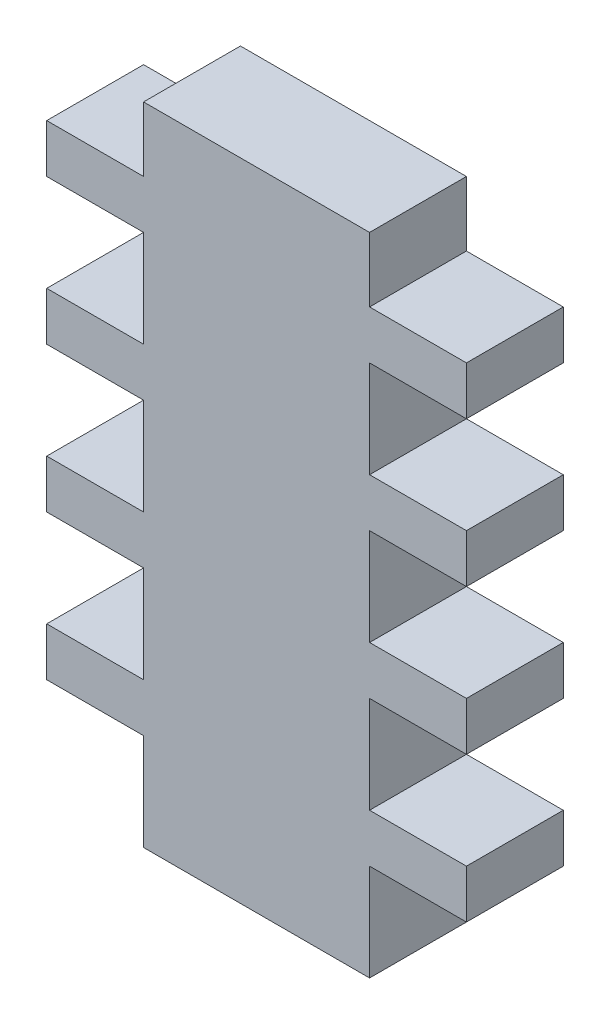
ISO-10303-21;
HEADER;
FILE_DESCRIPTION(('STEP AP214'),'2;1');
FILE_NAME('part.step','',(''),(''),'','','');
FILE_SCHEMA(('AUTOMOTIVE_DESIGN { 1 0 10303 214 1 1 1 1 }'));
ENDSEC;
DATA;
#1=APPLICATION_CONTEXT('core data for automotive mechanical design processes');
#2=APPLICATION_PROTOCOL_DEFINITION('international standard','automotive_design',2000,#1);
#3=PRODUCT_CONTEXT('',#1,'mechanical');
#4=PRODUCT('Part','Part','',(#3));
#5=PRODUCT_RELATED_PRODUCT_CATEGORY('part','',(#4));
#6=PRODUCT_DEFINITION_FORMATION('','',#4);
#7=PRODUCT_DEFINITION_CONTEXT('part definition',#1,'design');
#8=PRODUCT_DEFINITION('design','',#6,#7);
#9=PRODUCT_DEFINITION_SHAPE('','',#8);
#10=(LENGTH_UNIT() NAMED_UNIT(*) SI_UNIT(.MILLI.,.METRE.));
#11=(NAMED_UNIT(*) PLANE_ANGLE_UNIT() SI_UNIT($,.RADIAN.));
#12=(NAMED_UNIT(*) SI_UNIT($,.STERADIAN.) SOLID_ANGLE_UNIT());
#13=UNCERTAINTY_MEASURE_WITH_UNIT(LENGTH_MEASURE(1.E-05),#10,'distance_accuracy_value','');
#14=(GEOMETRIC_REPRESENTATION_CONTEXT(3) GLOBAL_UNCERTAINTY_ASSIGNED_CONTEXT((#13)) GLOBAL_UNIT_ASSIGNED_CONTEXT((#10,
#11,#12)) REPRESENTATION_CONTEXT('',''));
#15=CARTESIAN_POINT('',(0.,0.,0.));
#16=DIRECTION('',(0.,0.,1.));
#17=DIRECTION('',(1.,0.,0.));
#18=AXIS2_PLACEMENT_3D('',#15,#16,#17);
#19=CARTESIAN_POINT('',(6.5,-10.,3.));
#20=DIRECTION('',(-1.,0.,0.));
#21=DIRECTION('',(0.,0.,1.));
#22=AXIS2_PLACEMENT_3D('',#19,#20,#21);
#23=PLANE('',#22);
#24=DIRECTION('',(0.,1.,0.));
#25=VECTOR('',#24,1.);
#26=CARTESIAN_POINT('',(6.5,-10.,0.));
#27=LINE('',#26,#25);
#28=CARTESIAN_POINT('',(6.5,2.,0.));
#29=VERTEX_POINT('',#28);
#30=CARTESIAN_POINT('',(6.5,3.5,0.));
#31=VERTEX_POINT('',#30);
#32=EDGE_CURVE('E523',#29,#31,#27,.T.);
#33=ORIENTED_EDGE('',*,*,#32,.T.);
#34=DIRECTION('',(0.,0.,1.));
#35=VECTOR('',#34,1.);
#36=CARTESIAN_POINT('',(6.5,3.5,0.));
#37=LINE('',#36,#35);
#38=CARTESIAN_POINT('',(6.5,3.5,3.));
#39=VERTEX_POINT('',#38);
#40=EDGE_CURVE('E313',#31,#39,#37,.T.);
#41=ORIENTED_EDGE('',*,*,#40,.T.);
#42=DIRECTION('',(0.,1.,0.));
#43=VECTOR('',#42,1.);
#44=CARTESIAN_POINT('',(6.5,-10.,3.));
#45=LINE('',#44,#43);
#46=CARTESIAN_POINT('',(6.5,2.,3.));
#47=VERTEX_POINT('',#46);
#48=EDGE_CURVE('E514',#47,#39,#45,.T.);
#49=ORIENTED_EDGE('',*,*,#48,.F.);
#50=DIRECTION('',(0.,0.,1.));
#51=VECTOR('',#50,1.);
#52=CARTESIAN_POINT('',(6.5,2.,0.));
#53=LINE('',#52,#51);
#54=EDGE_CURVE('E330',#29,#47,#53,.T.);
#55=ORIENTED_EDGE('',*,*,#54,.F.);
#56=EDGE_LOOP('',(#33,#41,#49,#55));
#57=FACE_BOUND('',#56,.T.);
#58=ADVANCED_FACE('F38',(#57),#23,.F.);
#59=CARTESIAN_POINT('',(6.5,-2.5,0.));
#60=VERTEX_POINT('',#59);
#61=CARTESIAN_POINT('',(6.5,-0.999999999999998,0.));
#62=VERTEX_POINT('',#61);
#63=EDGE_CURVE('E604',#60,#62,#27,.T.);
#64=ORIENTED_EDGE('',*,*,#63,.T.);
#65=DIRECTION('',(0.,0.,1.));
#66=VECTOR('',#65,1.);
#67=CARTESIAN_POINT('',(6.5,-0.999999999999998,0.));
#68=LINE('',#67,#66);
#69=CARTESIAN_POINT('',(6.5,-0.999999999999998,3.));
#70=VERTEX_POINT('',#69);
#71=EDGE_CURVE('E337',#62,#70,#68,.T.);
#72=ORIENTED_EDGE('',*,*,#71,.T.);
#73=CARTESIAN_POINT('',(6.5,-2.5,3.));
#74=VERTEX_POINT('',#73);
#75=EDGE_CURVE('E623',#74,#70,#45,.T.);
#76=ORIENTED_EDGE('',*,*,#75,.F.);
#77=DIRECTION('',(0.,0.,1.));
#78=VECTOR('',#77,1.);
#79=CARTESIAN_POINT('',(6.5,-2.5,0.));
#80=LINE('',#79,#78);
#81=EDGE_CURVE('E354',#60,#74,#80,.T.);
#82=ORIENTED_EDGE('',*,*,#81,.F.);
#83=EDGE_LOOP('',(#64,#72,#76,#82));
#84=FACE_BOUND('',#83,.T.);
#85=ADVANCED_FACE('F637',(#84),#23,.F.);
#86=CARTESIAN_POINT('',(6.5,-7.,0.));
#87=VERTEX_POINT('',#86);
#88=CARTESIAN_POINT('',(6.5,-5.5,0.));
#89=VERTEX_POINT('',#88);
#90=EDGE_CURVE('E524',#87,#89,#27,.T.);
#91=ORIENTED_EDGE('',*,*,#90,.T.);
#92=DIRECTION('',(0.,0.,1.));
#93=VECTOR('',#92,1.);
#94=CARTESIAN_POINT('',(6.5,-5.5,0.));
#95=LINE('',#94,#93);
#96=CARTESIAN_POINT('',(6.5,-5.5,3.));
#97=VERTEX_POINT('',#96);
#98=EDGE_CURVE('E361',#89,#97,#95,.T.);
#99=ORIENTED_EDGE('',*,*,#98,.T.);
#100=CARTESIAN_POINT('',(6.5,-7.,3.));
#101=VERTEX_POINT('',#100);
#102=EDGE_CURVE('E515',#101,#97,#45,.T.);
#103=ORIENTED_EDGE('',*,*,#102,.F.);
#104=DIRECTION('',(0.,0.,1.));
#105=VECTOR('',#104,1.);
#106=CARTESIAN_POINT('',(6.5,-7.,0.));
#107=LINE('',#106,#105);
#108=EDGE_CURVE('E380',#87,#101,#107,.T.);
#109=ORIENTED_EDGE('',*,*,#108,.F.);
#110=EDGE_LOOP('',(#91,#99,#103,#109));
#111=FACE_BOUND('',#110,.T.);
#112=ADVANCED_FACE('F602',(#111),#23,.F.);
#113=CARTESIAN_POINT('',(-6.5,-10.,3.));
#114=DIRECTION('',(1.,0.,0.));
#115=DIRECTION('',(0.,0.,-1.));
#116=AXIS2_PLACEMENT_3D('',#113,#114,#115);
#117=PLANE('',#116);
#118=DIRECTION('',(0.,-1.,0.));
#119=VECTOR('',#118,1.);
#120=CARTESIAN_POINT('',(-6.5,-10.,3.));
#121=LINE('',#120,#119);
#122=CARTESIAN_POINT('',(-6.5,8.,3.));
#123=VERTEX_POINT('',#122);
#124=CARTESIAN_POINT('',(-6.5,6.5,3.));
#125=VERTEX_POINT('',#124);
#126=EDGE_CURVE('E47',#123,#125,#121,.T.);
#127=ORIENTED_EDGE('',*,*,#126,.F.);
#128=DIRECTION('',(0.,0.,1.));
#129=VECTOR('',#128,1.);
#130=CARTESIAN_POINT('',(-6.5,8.,0.));
#131=LINE('',#130,#129);
#132=CARTESIAN_POINT('',(-6.5,8.,0.));
#133=VERTEX_POINT('',#132);
#134=EDGE_CURVE('E403',#133,#123,#131,.T.);
#135=ORIENTED_EDGE('',*,*,#134,.F.);
#136=DIRECTION('',(0.,-1.,0.));
#137=VECTOR('',#136,1.);
#138=CARTESIAN_POINT('',(-6.5,-10.,0.));
#139=LINE('',#138,#137);
#140=CARTESIAN_POINT('',(-6.5,6.5,0.));
#141=VERTEX_POINT('',#140);
#142=EDGE_CURVE('E528',#133,#141,#139,.T.);
#143=ORIENTED_EDGE('',*,*,#142,.T.);
#144=DIRECTION('',(0.,0.,1.));
#145=VECTOR('',#144,1.);
#146=CARTESIAN_POINT('',(-6.5,6.5,0.));
#147=LINE('',#146,#145);
#148=EDGE_CURVE('E424',#141,#125,#147,.T.);
#149=ORIENTED_EDGE('',*,*,#148,.T.);
#150=EDGE_LOOP('',(#127,#135,#143,#149));
#151=FACE_BOUND('',#150,.T.);
#152=ADVANCED_FACE('F668',(#151),#117,.F.);
#153=CARTESIAN_POINT('',(-6.5,3.5,3.));
#154=VERTEX_POINT('',#153);
#155=CARTESIAN_POINT('',(-6.5,2.,3.));
#156=VERTEX_POINT('',#155);
#157=EDGE_CURVE('E555',#154,#156,#121,.T.);
#158=ORIENTED_EDGE('',*,*,#157,.F.);
#159=DIRECTION('',(0.,0.,1.));
#160=VECTOR('',#159,1.);
#161=CARTESIAN_POINT('',(-6.5,3.5,0.));
#162=LINE('',#161,#160);
#163=CARTESIAN_POINT('',(-6.5,3.5,0.));
#164=VERTEX_POINT('',#163);
#165=EDGE_CURVE('E417',#164,#154,#162,.T.);
#166=ORIENTED_EDGE('',*,*,#165,.F.);
#167=CARTESIAN_POINT('',(-6.5,2.,0.));
#168=VERTEX_POINT('',#167);
#169=EDGE_CURVE('E533',#164,#168,#139,.T.);
#170=ORIENTED_EDGE('',*,*,#169,.T.);
#171=DIRECTION('',(0.,0.,1.));
#172=VECTOR('',#171,1.);
#173=CARTESIAN_POINT('',(-6.5,2.,0.));
#174=LINE('',#173,#172);
#175=EDGE_CURVE('E450',#168,#156,#174,.T.);
#176=ORIENTED_EDGE('',*,*,#175,.T.);
#177=EDGE_LOOP('',(#158,#166,#170,#176));
#178=FACE_BOUND('',#177,.T.);
#179=ADVANCED_FACE('F544',(#178),#117,.F.);
#180=CARTESIAN_POINT('',(-6.5,-0.999999999999997,3.));
#181=VERTEX_POINT('',#180);
#182=CARTESIAN_POINT('',(-6.5,-2.5,3.));
#183=VERTEX_POINT('',#182);
#184=EDGE_CURVE('E520',#181,#183,#121,.T.);
#185=ORIENTED_EDGE('',*,*,#184,.F.);
#186=DIRECTION('',(0.,0.,1.));
#187=VECTOR('',#186,1.);
#188=CARTESIAN_POINT('',(-6.5,-0.999999999999997,0.));
#189=LINE('',#188,#187);
#190=CARTESIAN_POINT('',(-6.5,-0.999999999999997,0.));
#191=VERTEX_POINT('',#190);
#192=EDGE_CURVE('E443',#191,#181,#189,.T.);
#193=ORIENTED_EDGE('',*,*,#192,.F.);
#194=CARTESIAN_POINT('',(-6.5,-2.5,0.));
#195=VERTEX_POINT('',#194);
#196=EDGE_CURVE('E527',#191,#195,#139,.T.);
#197=ORIENTED_EDGE('',*,*,#196,.T.);
#198=DIRECTION('',(0.,0.,1.));
#199=VECTOR('',#198,1.);
#200=CARTESIAN_POINT('',(-6.5,-2.5,0.));
#201=LINE('',#200,#199);
#202=EDGE_CURVE('E476',#195,#183,#201,.T.);
#203=ORIENTED_EDGE('',*,*,#202,.T.);
#204=EDGE_LOOP('',(#185,#193,#197,#203));
#205=FACE_BOUND('',#204,.T.);
#206=ADVANCED_FACE('F564',(#205),#117,.F.);
#207=CARTESIAN_POINT('',(6.5,6.5,0.));
#208=VERTEX_POINT('',#207);
#209=CARTESIAN_POINT('',(6.5,8.,0.));
#210=VERTEX_POINT('',#209);
#211=EDGE_CURVE('E413',#208,#210,#27,.T.);
#212=ORIENTED_EDGE('',*,*,#211,.T.);
#213=DIRECTION('',(0.,0.,1.));
#214=VECTOR('',#213,1.);
#215=CARTESIAN_POINT('',(6.5,8.,0.));
#216=LINE('',#215,#214);
#217=CARTESIAN_POINT('',(6.5,8.,3.));
#218=VERTEX_POINT('',#217);
#219=EDGE_CURVE('E282',#210,#218,#216,.T.);
#220=ORIENTED_EDGE('',*,*,#219,.T.);
#221=CARTESIAN_POINT('',(6.5,6.5,3.));
#222=VERTEX_POINT('',#221);
#223=EDGE_CURVE('E511',#222,#218,#45,.T.);
#224=ORIENTED_EDGE('',*,*,#223,.F.);
#225=DIRECTION('',(0.,0.,1.));
#226=VECTOR('',#225,1.);
#227=CARTESIAN_POINT('',(6.5,6.5,0.));
#228=LINE('',#227,#226);
#229=EDGE_CURVE('E306',#208,#222,#228,.T.);
#230=ORIENTED_EDGE('',*,*,#229,.F.);
#231=EDGE_LOOP('',(#212,#220,#224,#230));
#232=FACE_BOUND('',#231,.T.);
#233=ADVANCED_FACE('F40',(#232),#23,.F.);
#234=CARTESIAN_POINT('',(-6.5,10.,3.));
#235=DIRECTION('',(0.,-1.,0.));
#236=DIRECTION('',(0.,0.,-1.));
#237=AXIS2_PLACEMENT_3D('',#234,#235,#236);
#238=PLANE('',#237);
#239=DIRECTION('',(-1.,0.,0.));
#240=VECTOR('',#239,1.);
#241=CARTESIAN_POINT('',(-6.5,10.,3.));
#242=LINE('',#241,#240);
#243=CARTESIAN_POINT('',(3.5,10.,3.));
#244=VERTEX_POINT('',#243);
#245=CARTESIAN_POINT('',(-3.5,10.,3.));
#246=VERTEX_POINT('',#245);
#247=EDGE_CURVE('E516',#244,#246,#242,.T.);
#248=ORIENTED_EDGE('',*,*,#247,.F.);
#249=DIRECTION('',(0.,0.,1.));
#250=VECTOR('',#249,1.);
#251=CARTESIAN_POINT('',(3.5,10.,0.));
#252=LINE('',#251,#250);
#253=CARTESIAN_POINT('',(3.5,10.,0.));
#254=VERTEX_POINT('',#253);
#255=EDGE_CURVE('E302',#254,#244,#252,.T.);
#256=ORIENTED_EDGE('',*,*,#255,.F.);
#257=DIRECTION('',(-1.,0.,0.));
#258=VECTOR('',#257,1.);
#259=CARTESIAN_POINT('',(-6.5,10.,0.));
#260=LINE('',#259,#258);
#261=CARTESIAN_POINT('',(-3.5,10.,0.));
#262=VERTEX_POINT('',#261);
#263=EDGE_CURVE('E295',#254,#262,#260,.T.);
#264=ORIENTED_EDGE('',*,*,#263,.T.);
#265=DIRECTION('',(0.,0.,1.));
#266=VECTOR('',#265,1.);
#267=CARTESIAN_POINT('',(-3.5,10.,0.));
#268=LINE('',#267,#266);
#269=EDGE_CURVE('E410',#262,#246,#268,.T.);
#270=ORIENTED_EDGE('',*,*,#269,.T.);
#271=EDGE_LOOP('',(#248,#256,#264,#270));
#272=FACE_BOUND('',#271,.T.);
#273=ADVANCED_FACE('F659',(#272),#238,.F.);
#274=CARTESIAN_POINT('',(-6.5,-5.5,3.));
#275=VERTEX_POINT('',#274);
#276=CARTESIAN_POINT('',(-6.5,-7.,3.));
#277=VERTEX_POINT('',#276);
#278=EDGE_CURVE('E518',#275,#277,#121,.T.);
#279=ORIENTED_EDGE('',*,*,#278,.F.);
#280=DIRECTION('',(0.,0.,1.));
#281=VECTOR('',#280,1.);
#282=CARTESIAN_POINT('',(-6.5,-5.5,0.));
#283=LINE('',#282,#281);
#284=CARTESIAN_POINT('',(-6.5,-5.5,0.));
#285=VERTEX_POINT('',#284);
#286=EDGE_CURVE('E469',#285,#275,#283,.T.);
#287=ORIENTED_EDGE('',*,*,#286,.F.);
#288=CARTESIAN_POINT('',(-6.5,-7.,0.));
#289=VERTEX_POINT('',#288);
#290=EDGE_CURVE('E525',#285,#289,#139,.T.);
#291=ORIENTED_EDGE('',*,*,#290,.T.);
#292=DIRECTION('',(0.,0.,1.));
#293=VECTOR('',#292,1.);
#294=CARTESIAN_POINT('',(-6.5,-7.,0.));
#295=LINE('',#294,#293);
#296=EDGE_CURVE('E304',#289,#277,#295,.T.);
#297=ORIENTED_EDGE('',*,*,#296,.T.);
#298=EDGE_LOOP('',(#279,#287,#291,#297));
#299=FACE_BOUND('',#298,.T.);
#300=ADVANCED_FACE('F577',(#299),#117,.F.);
#301=CARTESIAN_POINT('',(-6.5,-10.,3.));
#302=DIRECTION('',(0.,1.,0.));
#303=DIRECTION('',(0.,0.,1.));
#304=AXIS2_PLACEMENT_3D('',#301,#302,#303);
#305=PLANE('',#304);
#306=DIRECTION('',(1.,0.,0.));
#307=VECTOR('',#306,1.);
#308=CARTESIAN_POINT('',(-6.5,-10.,0.));
#309=LINE('',#308,#307);
#310=CARTESIAN_POINT('',(-3.5,-10.,0.));
#311=VERTEX_POINT('',#310);
#312=CARTESIAN_POINT('',(3.5,-10.,0.));
#313=VERTEX_POINT('',#312);
#314=EDGE_CURVE('E42',#311,#313,#309,.T.);
#315=ORIENTED_EDGE('',*,*,#314,.T.);
#316=DIRECTION('',(0.,0.,1.));
#317=VECTOR('',#316,1.);
#318=CARTESIAN_POINT('',(3.5,-10.,0.));
#319=LINE('',#318,#317);
#320=CARTESIAN_POINT('',(3.5,-10.,3.));
#321=VERTEX_POINT('',#320);
#322=EDGE_CURVE('E385',#313,#321,#319,.T.);
#323=ORIENTED_EDGE('',*,*,#322,.T.);
#324=DIRECTION('',(1.,0.,0.));
#325=VECTOR('',#324,1.);
#326=CARTESIAN_POINT('',(-6.5,-10.,3.));
#327=LINE('',#326,#325);
#328=CARTESIAN_POINT('',(-3.5,-10.,3.));
#329=VERTEX_POINT('',#328);
#330=EDGE_CURVE('E11',#329,#321,#327,.T.);
#331=ORIENTED_EDGE('',*,*,#330,.F.);
#332=DIRECTION('',(0.,0.,1.));
#333=VECTOR('',#332,1.);
#334=CARTESIAN_POINT('',(-3.5,-10.,0.));
#335=LINE('',#334,#333);
#336=EDGE_CURVE('E495',#311,#329,#335,.T.);
#337=ORIENTED_EDGE('',*,*,#336,.F.);
#338=EDGE_LOOP('',(#315,#323,#331,#337));
#339=FACE_BOUND('',#338,.T.);
#340=ADVANCED_FACE('F588',(#339),#305,.F.);
#341=CARTESIAN_POINT('',(0.,0.,3.));
#342=DIRECTION('',(0.,0.,-1.));
#343=DIRECTION('',(-1.,0.,0.));
#344=AXIS2_PLACEMENT_3D('',#341,#342,#343);
#345=PLANE('',#344);
#346=DIRECTION('',(1.,0.,0.));
#347=VECTOR('',#346,1.);
#348=CARTESIAN_POINT('',(3.5,8.,3.));
#349=LINE('',#348,#347);
#350=CARTESIAN_POINT('',(3.5,8.,3.));
#351=VERTEX_POINT('',#350);
#352=EDGE_CURVE('E296',#351,#218,#349,.T.);
#353=ORIENTED_EDGE('',*,*,#352,.F.);
#354=DIRECTION('',(0.,-1.,0.));
#355=VECTOR('',#354,1.);
#356=CARTESIAN_POINT('',(3.5,10.,3.));
#357=LINE('',#356,#355);
#358=EDGE_CURVE('E279',#244,#351,#357,.T.);
#359=ORIENTED_EDGE('',*,*,#358,.F.);
#360=ORIENTED_EDGE('',*,*,#247,.T.);
#361=DIRECTION('',(0.,1.,0.));
#362=VECTOR('',#361,1.);
#363=CARTESIAN_POINT('',(-3.5,8.,3.));
#364=LINE('',#363,#362);
#365=CARTESIAN_POINT('',(-3.5,8.,3.));
#366=VERTEX_POINT('',#365);
#367=EDGE_CURVE('E401',#366,#246,#364,.T.);
#368=ORIENTED_EDGE('',*,*,#367,.F.);
#369=DIRECTION('',(1.,0.,0.));
#370=VECTOR('',#369,1.);
#371=CARTESIAN_POINT('',(-6.5,8.,3.));
#372=LINE('',#371,#370);
#373=EDGE_CURVE('E404',#123,#366,#372,.T.);
#374=ORIENTED_EDGE('',*,*,#373,.F.);
#375=ORIENTED_EDGE('',*,*,#126,.T.);
#376=DIRECTION('',(-1.,0.,0.));
#377=VECTOR('',#376,1.);
#378=CARTESIAN_POINT('',(-6.5,6.5,3.));
#379=LINE('',#378,#377);
#380=CARTESIAN_POINT('',(-3.5,6.5,3.));
#381=VERTEX_POINT('',#380);
#382=EDGE_CURVE('E428',#381,#125,#379,.T.);
#383=ORIENTED_EDGE('',*,*,#382,.F.);
#384=DIRECTION('',(0.,1.,0.));
#385=VECTOR('',#384,1.);
#386=CARTESIAN_POINT('',(-3.5,6.5,3.));
#387=LINE('',#386,#385);
#388=CARTESIAN_POINT('',(-3.5,3.5,3.));
#389=VERTEX_POINT('',#388);
#390=EDGE_CURVE('E430',#389,#381,#387,.T.);
#391=ORIENTED_EDGE('',*,*,#390,.F.);
#392=DIRECTION('',(1.,0.,0.));
#393=VECTOR('',#392,1.);
#394=CARTESIAN_POINT('',(-6.5,3.5,3.));
#395=LINE('',#394,#393);
#396=EDGE_CURVE('E407',#154,#389,#395,.T.);
#397=ORIENTED_EDGE('',*,*,#396,.F.);
#398=ORIENTED_EDGE('',*,*,#157,.T.);
#399=DIRECTION('',(-1.,0.,0.));
#400=VECTOR('',#399,1.);
#401=CARTESIAN_POINT('',(-6.5,2.,3.));
#402=LINE('',#401,#400);
#403=CARTESIAN_POINT('',(-3.5,2.,3.));
#404=VERTEX_POINT('',#403);
#405=EDGE_CURVE('E454',#404,#156,#402,.T.);
#406=ORIENTED_EDGE('',*,*,#405,.F.);
#407=DIRECTION('',(0.,1.,0.));
#408=VECTOR('',#407,1.);
#409=CARTESIAN_POINT('',(-3.5,2.,3.));
#410=LINE('',#409,#408);
#411=CARTESIAN_POINT('',(-3.5,-0.999999999999997,3.));
#412=VERTEX_POINT('',#411);
#413=EDGE_CURVE('E456',#412,#404,#410,.T.);
#414=ORIENTED_EDGE('',*,*,#413,.F.);
#415=DIRECTION('',(1.,0.,0.));
#416=VECTOR('',#415,1.);
#417=CARTESIAN_POINT('',(-6.5,-0.999999999999997,3.));
#418=LINE('',#417,#416);
#419=EDGE_CURVE('E427',#181,#412,#418,.T.);
#420=ORIENTED_EDGE('',*,*,#419,.F.);
#421=ORIENTED_EDGE('',*,*,#184,.T.);
#422=DIRECTION('',(-1.,0.,0.));
#423=VECTOR('',#422,1.);
#424=CARTESIAN_POINT('',(-6.5,-2.5,3.));
#425=LINE('',#424,#423);
#426=CARTESIAN_POINT('',(-3.5,-2.5,3.));
#427=VERTEX_POINT('',#426);
#428=EDGE_CURVE('E480',#427,#183,#425,.T.);
#429=ORIENTED_EDGE('',*,*,#428,.F.);
#430=DIRECTION('',(0.,1.,0.));
#431=VECTOR('',#430,1.);
#432=CARTESIAN_POINT('',(-3.5,-2.5,3.));
#433=LINE('',#432,#431);
#434=CARTESIAN_POINT('',(-3.5,-5.5,3.));
#435=VERTEX_POINT('',#434);
#436=EDGE_CURVE('E482',#435,#427,#433,.T.);
#437=ORIENTED_EDGE('',*,*,#436,.F.);
#438=DIRECTION('',(1.,0.,0.));
#439=VECTOR('',#438,1.);
#440=CARTESIAN_POINT('',(-6.5,-5.5,3.));
#441=LINE('',#440,#439);
#442=EDGE_CURVE('E453',#275,#435,#441,.T.);
#443=ORIENTED_EDGE('',*,*,#442,.F.);
#444=ORIENTED_EDGE('',*,*,#278,.T.);
#445=DIRECTION('',(-1.,0.,0.));
#446=VECTOR('',#445,1.);
#447=CARTESIAN_POINT('',(-6.5,-7.,3.));
#448=LINE('',#447,#446);
#449=CARTESIAN_POINT('',(-3.5,-7.,3.));
#450=VERTEX_POINT('',#449);
#451=EDGE_CURVE('E502',#450,#277,#448,.T.);
#452=ORIENTED_EDGE('',*,*,#451,.F.);
#453=DIRECTION('',(0.,1.,0.));
#454=VECTOR('',#453,1.);
#455=CARTESIAN_POINT('',(-3.5,-7.,3.));
#456=LINE('',#455,#454);
#457=EDGE_CURVE('E479',#329,#450,#456,.T.);
#458=ORIENTED_EDGE('',*,*,#457,.F.);
#459=ORIENTED_EDGE('',*,*,#330,.T.);
#460=DIRECTION('',(0.,-1.,0.));
#461=VECTOR('',#460,1.);
#462=CARTESIAN_POINT('',(3.5,-7.,3.));
#463=LINE('',#462,#461);
#464=CARTESIAN_POINT('',(3.5,-7.,3.));
#465=VERTEX_POINT('',#464);
#466=EDGE_CURVE('E388',#465,#321,#463,.T.);
#467=ORIENTED_EDGE('',*,*,#466,.F.);
#468=DIRECTION('',(-1.,0.,0.));
#469=VECTOR('',#468,1.);
#470=CARTESIAN_POINT('',(6.5,-7.,3.));
#471=LINE('',#470,#469);
#472=EDGE_CURVE('E364',#101,#465,#471,.T.);
#473=ORIENTED_EDGE('',*,*,#472,.F.);
#474=ORIENTED_EDGE('',*,*,#102,.T.);
#475=DIRECTION('',(1.,0.,0.));
#476=VECTOR('',#475,1.);
#477=CARTESIAN_POINT('',(6.5,-5.5,3.));
#478=LINE('',#477,#476);
#479=CARTESIAN_POINT('',(3.5,-5.5,3.));
#480=VERTEX_POINT('',#479);
#481=EDGE_CURVE('E365',#480,#97,#478,.T.);
#482=ORIENTED_EDGE('',*,*,#481,.F.);
#483=DIRECTION('',(0.,-1.,0.));
#484=VECTOR('',#483,1.);
#485=CARTESIAN_POINT('',(3.5,-2.5,3.));
#486=LINE('',#485,#484);
#487=CARTESIAN_POINT('',(3.5,-2.5,3.));
#488=VERTEX_POINT('',#487);
#489=EDGE_CURVE('E367',#488,#480,#486,.T.);
#490=ORIENTED_EDGE('',*,*,#489,.F.);
#491=DIRECTION('',(-1.,0.,0.));
#492=VECTOR('',#491,1.);
#493=CARTESIAN_POINT('',(6.5,-2.5,3.));
#494=LINE('',#493,#492);
#495=EDGE_CURVE('E340',#74,#488,#494,.T.);
#496=ORIENTED_EDGE('',*,*,#495,.F.);
#497=ORIENTED_EDGE('',*,*,#75,.T.);
#498=DIRECTION('',(1.,0.,0.));
#499=VECTOR('',#498,1.);
#500=CARTESIAN_POINT('',(6.5,-0.999999999999998,3.));
#501=LINE('',#500,#499);
#502=CARTESIAN_POINT('',(3.5,-0.999999999999998,3.));
#503=VERTEX_POINT('',#502);
#504=EDGE_CURVE('E341',#503,#70,#501,.T.);
#505=ORIENTED_EDGE('',*,*,#504,.F.);
#506=DIRECTION('',(0.,-1.,0.));
#507=VECTOR('',#506,1.);
#508=CARTESIAN_POINT('',(3.5,2.,3.));
#509=LINE('',#508,#507);
#510=CARTESIAN_POINT('',(3.5,2.,3.));
#511=VERTEX_POINT('',#510);
#512=EDGE_CURVE('E343',#511,#503,#509,.T.);
#513=ORIENTED_EDGE('',*,*,#512,.F.);
#514=DIRECTION('',(-1.,0.,0.));
#515=VECTOR('',#514,1.);
#516=CARTESIAN_POINT('',(6.5,2.,3.));
#517=LINE('',#516,#515);
#518=EDGE_CURVE('E316',#47,#511,#517,.T.);
#519=ORIENTED_EDGE('',*,*,#518,.F.);
#520=ORIENTED_EDGE('',*,*,#48,.T.);
#521=DIRECTION('',(1.,0.,0.));
#522=VECTOR('',#521,1.);
#523=CARTESIAN_POINT('',(6.5,3.5,3.));
#524=LINE('',#523,#522);
#525=CARTESIAN_POINT('',(3.5,3.5,3.));
#526=VERTEX_POINT('',#525);
#527=EDGE_CURVE('E317',#526,#39,#524,.T.);
#528=ORIENTED_EDGE('',*,*,#527,.F.);
#529=DIRECTION('',(0.,-1.,0.));
#530=VECTOR('',#529,1.);
#531=CARTESIAN_POINT('',(3.5,6.5,3.));
#532=LINE('',#531,#530);
#533=CARTESIAN_POINT('',(3.5,6.5,3.));
#534=VERTEX_POINT('',#533);
#535=EDGE_CURVE('E319',#534,#526,#532,.T.);
#536=ORIENTED_EDGE('',*,*,#535,.F.);
#537=DIRECTION('',(-1.,0.,0.));
#538=VECTOR('',#537,1.);
#539=CARTESIAN_POINT('',(6.5,6.5,3.));
#540=LINE('',#539,#538);
#541=EDGE_CURVE('E300',#222,#534,#540,.T.);
#542=ORIENTED_EDGE('',*,*,#541,.F.);
#543=ORIENTED_EDGE('',*,*,#223,.T.);
#544=EDGE_LOOP('',(#353,#359,#360,#368,#374,#375,#383,#391,#397,#398,#406,#414,#420,#421,#429,
#437,#443,#444,#452,#458,#459,#467,#473,#474,#482,#490,#496,#497,#505,#513,#519,#520,#528,#536,
#542,#543));
#545=FACE_BOUND('',#544,.T.);
#546=ADVANCED_FACE('F552',(#545),#345,.F.);
#547=CARTESIAN_POINT('',(0.,0.,0.));
#548=DIRECTION('',(0.,0.,-1.));
#549=DIRECTION('',(-1.,0.,0.));
#550=AXIS2_PLACEMENT_3D('',#547,#548,#549);
#551=PLANE('',#550);
#552=DIRECTION('',(0.,-1.,0.));
#553=VECTOR('',#552,1.);
#554=CARTESIAN_POINT('',(3.5,10.,0.));
#555=LINE('',#554,#553);
#556=CARTESIAN_POINT('',(3.5,8.,0.));
#557=VERTEX_POINT('',#556);
#558=EDGE_CURVE('E276',#254,#557,#555,.T.);
#559=ORIENTED_EDGE('',*,*,#558,.T.);
#560=DIRECTION('',(1.,0.,0.));
#561=VECTOR('',#560,1.);
#562=CARTESIAN_POINT('',(3.5,8.,0.));
#563=LINE('',#562,#561);
#564=EDGE_CURVE('E283',#557,#210,#563,.T.);
#565=ORIENTED_EDGE('',*,*,#564,.T.);
#566=ORIENTED_EDGE('',*,*,#211,.F.);
#567=DIRECTION('',(-1.,0.,0.));
#568=VECTOR('',#567,1.);
#569=CARTESIAN_POINT('',(6.5,6.5,0.));
#570=LINE('',#569,#568);
#571=CARTESIAN_POINT('',(3.5,6.5,0.));
#572=VERTEX_POINT('',#571);
#573=EDGE_CURVE('E320',#208,#572,#570,.T.);
#574=ORIENTED_EDGE('',*,*,#573,.T.);
#575=DIRECTION('',(0.,-1.,0.));
#576=VECTOR('',#575,1.);
#577=CARTESIAN_POINT('',(3.5,6.5,0.));
#578=LINE('',#577,#576);
#579=CARTESIAN_POINT('',(3.5,3.5,0.));
#580=VERTEX_POINT('',#579);
#581=EDGE_CURVE('E55',#572,#580,#578,.T.);
#582=ORIENTED_EDGE('',*,*,#581,.T.);
#583=DIRECTION('',(1.,0.,0.));
#584=VECTOR('',#583,1.);
#585=CARTESIAN_POINT('',(6.5,3.5,0.));
#586=LINE('',#585,#584);
#587=EDGE_CURVE('E308',#580,#31,#586,.T.);
#588=ORIENTED_EDGE('',*,*,#587,.T.);
#589=ORIENTED_EDGE('',*,*,#32,.F.);
#590=DIRECTION('',(-1.,0.,0.));
#591=VECTOR('',#590,1.);
#592=CARTESIAN_POINT('',(6.5,2.,0.));
#593=LINE('',#592,#591);
#594=CARTESIAN_POINT('',(3.5,2.,0.));
#595=VERTEX_POINT('',#594);
#596=EDGE_CURVE('E344',#29,#595,#593,.T.);
#597=ORIENTED_EDGE('',*,*,#596,.T.);
#598=DIRECTION('',(0.,-1.,0.));
#599=VECTOR('',#598,1.);
#600=CARTESIAN_POINT('',(3.5,2.,0.));
#601=LINE('',#600,#599);
#602=CARTESIAN_POINT('',(3.5,-0.999999999999998,0.));
#603=VERTEX_POINT('',#602);
#604=EDGE_CURVE('E63',#595,#603,#601,.T.);
#605=ORIENTED_EDGE('',*,*,#604,.T.);
#606=DIRECTION('',(1.,0.,0.));
#607=VECTOR('',#606,1.);
#608=CARTESIAN_POINT('',(6.5,-0.999999999999998,0.));
#609=LINE('',#608,#607);
#610=EDGE_CURVE('E332',#603,#62,#609,.T.);
#611=ORIENTED_EDGE('',*,*,#610,.T.);
#612=ORIENTED_EDGE('',*,*,#63,.F.);
#613=DIRECTION('',(-1.,0.,0.));
#614=VECTOR('',#613,1.);
#615=CARTESIAN_POINT('',(6.5,-2.5,0.));
#616=LINE('',#615,#614);
#617=CARTESIAN_POINT('',(3.5,-2.5,0.));
#618=VERTEX_POINT('',#617);
#619=EDGE_CURVE('E368',#60,#618,#616,.T.);
#620=ORIENTED_EDGE('',*,*,#619,.T.);
#621=DIRECTION('',(0.,-1.,0.));
#622=VECTOR('',#621,1.);
#623=CARTESIAN_POINT('',(3.5,-2.5,0.));
#624=LINE('',#623,#622);
#625=CARTESIAN_POINT('',(3.5,-5.5,0.));
#626=VERTEX_POINT('',#625);
#627=EDGE_CURVE('E375',#618,#626,#624,.T.);
#628=ORIENTED_EDGE('',*,*,#627,.T.);
#629=DIRECTION('',(1.,0.,0.));
#630=VECTOR('',#629,1.);
#631=CARTESIAN_POINT('',(6.5,-5.5,0.));
#632=LINE('',#631,#630);
#633=EDGE_CURVE('E356',#626,#89,#632,.T.);
#634=ORIENTED_EDGE('',*,*,#633,.T.);
#635=ORIENTED_EDGE('',*,*,#90,.F.);
#636=DIRECTION('',(-1.,0.,0.));
#637=VECTOR('',#636,1.);
#638=CARTESIAN_POINT('',(6.5,-7.,0.));
#639=LINE('',#638,#637);
#640=CARTESIAN_POINT('',(3.5,-7.,0.));
#641=VERTEX_POINT('',#640);
#642=EDGE_CURVE('E390',#87,#641,#639,.T.);
#643=ORIENTED_EDGE('',*,*,#642,.T.);
#644=DIRECTION('',(0.,-1.,0.));
#645=VECTOR('',#644,1.);
#646=CARTESIAN_POINT('',(3.5,-7.,0.));
#647=LINE('',#646,#645);
#648=EDGE_CURVE('E382',#641,#313,#647,.T.);
#649=ORIENTED_EDGE('',*,*,#648,.T.);
#650=ORIENTED_EDGE('',*,*,#314,.F.);
#651=DIRECTION('',(0.,1.,0.));
#652=VECTOR('',#651,1.);
#653=CARTESIAN_POINT('',(-3.5,-7.,0.));
#654=LINE('',#653,#652);
#655=CARTESIAN_POINT('',(-3.5,-7.,0.));
#656=VERTEX_POINT('',#655);
#657=EDGE_CURVE('E504',#311,#656,#654,.T.);
#658=ORIENTED_EDGE('',*,*,#657,.T.);
#659=DIRECTION('',(-1.,0.,0.));
#660=VECTOR('',#659,1.);
#661=CARTESIAN_POINT('',(-6.5,-7.,0.));
#662=LINE('',#661,#660);
#663=EDGE_CURVE('E497',#656,#289,#662,.T.);
#664=ORIENTED_EDGE('',*,*,#663,.T.);
#665=ORIENTED_EDGE('',*,*,#290,.F.);
#666=DIRECTION('',(1.,0.,0.));
#667=VECTOR('',#666,1.);
#668=CARTESIAN_POINT('',(-6.5,-5.5,0.));
#669=LINE('',#668,#667);
#670=CARTESIAN_POINT('',(-3.5,-5.5,0.));
#671=VERTEX_POINT('',#670);
#672=EDGE_CURVE('E483',#285,#671,#669,.T.);
#673=ORIENTED_EDGE('',*,*,#672,.T.);
#674=DIRECTION('',(0.,1.,0.));
#675=VECTOR('',#674,1.);
#676=CARTESIAN_POINT('',(-3.5,-2.5,0.));
#677=LINE('',#676,#675);
#678=CARTESIAN_POINT('',(-3.5,-2.5,0.));
#679=VERTEX_POINT('',#678);
#680=EDGE_CURVE('E490',#671,#679,#677,.T.);
#681=ORIENTED_EDGE('',*,*,#680,.T.);
#682=DIRECTION('',(-1.,0.,0.));
#683=VECTOR('',#682,1.);
#684=CARTESIAN_POINT('',(-6.5,-2.5,0.));
#685=LINE('',#684,#683);
#686=EDGE_CURVE('E471',#679,#195,#685,.T.);
#687=ORIENTED_EDGE('',*,*,#686,.T.);
#688=ORIENTED_EDGE('',*,*,#196,.F.);
#689=DIRECTION('',(1.,0.,0.));
#690=VECTOR('',#689,1.);
#691=CARTESIAN_POINT('',(-6.5,-0.999999999999997,0.));
#692=LINE('',#691,#690);
#693=CARTESIAN_POINT('',(-3.5,-0.999999999999997,0.));
#694=VERTEX_POINT('',#693);
#695=EDGE_CURVE('E457',#191,#694,#692,.T.);
#696=ORIENTED_EDGE('',*,*,#695,.T.);
#697=DIRECTION('',(0.,1.,0.));
#698=VECTOR('',#697,1.);
#699=CARTESIAN_POINT('',(-3.5,2.,0.));
#700=LINE('',#699,#698);
#701=CARTESIAN_POINT('',(-3.5,2.,0.));
#702=VERTEX_POINT('',#701);
#703=EDGE_CURVE('E464',#694,#702,#700,.T.);
#704=ORIENTED_EDGE('',*,*,#703,.T.);
#705=DIRECTION('',(-1.,0.,0.));
#706=VECTOR('',#705,1.);
#707=CARTESIAN_POINT('',(-6.5,2.,0.));
#708=LINE('',#707,#706);
#709=EDGE_CURVE('E445',#702,#168,#708,.T.);
#710=ORIENTED_EDGE('',*,*,#709,.T.);
#711=ORIENTED_EDGE('',*,*,#169,.F.);
#712=DIRECTION('',(1.,0.,0.));
#713=VECTOR('',#712,1.);
#714=CARTESIAN_POINT('',(-6.5,3.5,0.));
#715=LINE('',#714,#713);
#716=CARTESIAN_POINT('',(-3.5,3.5,0.));
#717=VERTEX_POINT('',#716);
#718=EDGE_CURVE('E431',#164,#717,#715,.T.);
#719=ORIENTED_EDGE('',*,*,#718,.T.);
#720=DIRECTION('',(0.,1.,0.));
#721=VECTOR('',#720,1.);
#722=CARTESIAN_POINT('',(-3.5,6.5,0.));
#723=LINE('',#722,#721);
#724=CARTESIAN_POINT('',(-3.5,6.5,0.));
#725=VERTEX_POINT('',#724);
#726=EDGE_CURVE('E438',#717,#725,#723,.T.);
#727=ORIENTED_EDGE('',*,*,#726,.T.);
#728=DIRECTION('',(-1.,0.,0.));
#729=VECTOR('',#728,1.);
#730=CARTESIAN_POINT('',(-6.5,6.5,0.));
#731=LINE('',#730,#729);
#732=EDGE_CURVE('E419',#725,#141,#731,.T.);
#733=ORIENTED_EDGE('',*,*,#732,.T.);
#734=ORIENTED_EDGE('',*,*,#142,.F.);
#735=DIRECTION('',(1.,0.,0.));
#736=VECTOR('',#735,1.);
#737=CARTESIAN_POINT('',(-6.5,8.,0.));
#738=LINE('',#737,#736);
#739=CARTESIAN_POINT('',(-3.5,8.,0.));
#740=VERTEX_POINT('',#739);
#741=EDGE_CURVE('E397',#133,#740,#738,.T.);
#742=ORIENTED_EDGE('',*,*,#741,.T.);
#743=DIRECTION('',(0.,1.,0.));
#744=VECTOR('',#743,1.);
#745=CARTESIAN_POINT('',(-3.5,8.,0.));
#746=LINE('',#745,#744);
#747=EDGE_CURVE('E400',#740,#262,#746,.T.);
#748=ORIENTED_EDGE('',*,*,#747,.T.);
#749=ORIENTED_EDGE('',*,*,#263,.F.);
#750=EDGE_LOOP('',(#559,#565,#566,#574,#582,#588,#589,#597,#605,#611,#612,#620,#628,#634,#635,
#643,#649,#650,#658,#664,#665,#673,#681,#687,#688,#696,#704,#710,#711,#719,#727,#733,#734,#742,
#748,#749));
#751=FACE_BOUND('',#750,.T.);
#752=ADVANCED_FACE('F293',(#751),#551,.T.);
#753=CARTESIAN_POINT('',(-6.5,-7.,0.));
#754=DIRECTION('',(0.,1.,0.));
#755=DIRECTION('',(-1.,0.,0.));
#756=AXIS2_PLACEMENT_3D('',#753,#754,#755);
#757=PLANE('',#756);
#758=ORIENTED_EDGE('',*,*,#451,.T.);
#759=ORIENTED_EDGE('',*,*,#296,.F.);
#760=ORIENTED_EDGE('',*,*,#663,.F.);
#761=DIRECTION('',(0.,0.,1.));
#762=VECTOR('',#761,1.);
#763=CARTESIAN_POINT('',(-3.5,-7.,0.));
#764=LINE('',#763,#762);
#765=EDGE_CURVE('E498',#656,#450,#764,.T.);
#766=ORIENTED_EDGE('',*,*,#765,.T.);
#767=EDGE_LOOP('',(#758,#759,#760,#766));
#768=FACE_BOUND('',#767,.T.);
#769=ADVANCED_FACE('F579',(#768),#757,.F.);
#770=CARTESIAN_POINT('',(-3.5,-7.,0.));
#771=DIRECTION('',(1.,0.,0.));
#772=DIRECTION('',(0.,1.,0.));
#773=AXIS2_PLACEMENT_3D('',#770,#771,#772);
#774=PLANE('',#773);
#775=ORIENTED_EDGE('',*,*,#457,.T.);
#776=ORIENTED_EDGE('',*,*,#765,.F.);
#777=ORIENTED_EDGE('',*,*,#657,.F.);
#778=ORIENTED_EDGE('',*,*,#336,.T.);
#779=EDGE_LOOP('',(#775,#776,#777,#778));
#780=FACE_BOUND('',#779,.T.);
#781=ADVANCED_FACE('F584',(#780),#774,.F.);
#782=CARTESIAN_POINT('',(-6.5,-2.5,0.));
#783=DIRECTION('',(0.,1.,0.));
#784=DIRECTION('',(-1.,0.,0.));
#785=AXIS2_PLACEMENT_3D('',#782,#783,#784);
#786=PLANE('',#785);
#787=ORIENTED_EDGE('',*,*,#428,.T.);
#788=ORIENTED_EDGE('',*,*,#202,.F.);
#789=ORIENTED_EDGE('',*,*,#686,.F.);
#790=DIRECTION('',(0.,0.,1.));
#791=VECTOR('',#790,1.);
#792=CARTESIAN_POINT('',(-3.5,-2.5,0.));
#793=LINE('',#792,#791);
#794=EDGE_CURVE('E474',#679,#427,#793,.T.);
#795=ORIENTED_EDGE('',*,*,#794,.T.);
#796=EDGE_LOOP('',(#787,#788,#789,#795));
#797=FACE_BOUND('',#796,.T.);
#798=ADVANCED_FACE('F568',(#797),#786,.F.);
#799=CARTESIAN_POINT('',(-3.5,-2.5,0.));
#800=DIRECTION('',(1.,0.,0.));
#801=DIRECTION('',(0.,0.,-1.));
#802=AXIS2_PLACEMENT_3D('',#799,#800,#801);
#803=PLANE('',#802);
#804=ORIENTED_EDGE('',*,*,#436,.T.);
#805=ORIENTED_EDGE('',*,*,#794,.F.);
#806=ORIENTED_EDGE('',*,*,#680,.F.);
#807=DIRECTION('',(0.,0.,1.));
#808=VECTOR('',#807,1.);
#809=CARTESIAN_POINT('',(-3.5,-5.5,0.));
#810=LINE('',#809,#808);
#811=EDGE_CURVE('E472',#671,#435,#810,.T.);
#812=ORIENTED_EDGE('',*,*,#811,.T.);
#813=EDGE_LOOP('',(#804,#805,#806,#812));
#814=FACE_BOUND('',#813,.T.);
#815=ADVANCED_FACE('F571',(#814),#803,.F.);
#816=CARTESIAN_POINT('',(-6.5,-5.5,0.));
#817=DIRECTION('',(0.,-1.,0.));
#818=DIRECTION('',(0.,0.,-1.));
#819=AXIS2_PLACEMENT_3D('',#816,#817,#818);
#820=PLANE('',#819);
#821=ORIENTED_EDGE('',*,*,#442,.T.);
#822=ORIENTED_EDGE('',*,*,#811,.F.);
#823=ORIENTED_EDGE('',*,*,#672,.F.);
#824=ORIENTED_EDGE('',*,*,#286,.T.);
#825=EDGE_LOOP('',(#821,#822,#823,#824));
#826=FACE_BOUND('',#825,.T.);
#827=ADVANCED_FACE('F573',(#826),#820,.F.);
#828=CARTESIAN_POINT('',(-6.5,2.,0.));
#829=DIRECTION('',(0.,1.,0.));
#830=DIRECTION('',(-1.,0.,0.));
#831=AXIS2_PLACEMENT_3D('',#828,#829,#830);
#832=PLANE('',#831);
#833=ORIENTED_EDGE('',*,*,#405,.T.);
#834=ORIENTED_EDGE('',*,*,#175,.F.);
#835=ORIENTED_EDGE('',*,*,#709,.F.);
#836=DIRECTION('',(0.,0.,1.));
#837=VECTOR('',#836,1.);
#838=CARTESIAN_POINT('',(-3.5,2.,0.));
#839=LINE('',#838,#837);
#840=EDGE_CURVE('E448',#702,#404,#839,.T.);
#841=ORIENTED_EDGE('',*,*,#840,.T.);
#842=EDGE_LOOP('',(#833,#834,#835,#841));
#843=FACE_BOUND('',#842,.T.);
#844=ADVANCED_FACE('F548',(#843),#832,.F.);
#845=CARTESIAN_POINT('',(-3.5,2.,0.));
#846=DIRECTION('',(1.,0.,0.));
#847=DIRECTION('',(0.,1.,0.));
#848=AXIS2_PLACEMENT_3D('',#845,#846,#847);
#849=PLANE('',#848);
#850=ORIENTED_EDGE('',*,*,#413,.T.);
#851=ORIENTED_EDGE('',*,*,#840,.F.);
#852=ORIENTED_EDGE('',*,*,#703,.F.);
#853=DIRECTION('',(0.,0.,1.));
#854=VECTOR('',#853,1.);
#855=CARTESIAN_POINT('',(-3.5,-0.999999999999997,0.));
#856=LINE('',#855,#854);
#857=EDGE_CURVE('E446',#694,#412,#856,.T.);
#858=ORIENTED_EDGE('',*,*,#857,.T.);
#859=EDGE_LOOP('',(#850,#851,#852,#858));
#860=FACE_BOUND('',#859,.T.);
#861=ADVANCED_FACE('F700',(#860),#849,.F.);
#862=CARTESIAN_POINT('',(-6.5,-0.999999999999997,0.));
#863=DIRECTION('',(0.,-1.,0.));
#864=DIRECTION('',(0.,0.,-1.));
#865=AXIS2_PLACEMENT_3D('',#862,#863,#864);
#866=PLANE('',#865);
#867=ORIENTED_EDGE('',*,*,#419,.T.);
#868=ORIENTED_EDGE('',*,*,#857,.F.);
#869=ORIENTED_EDGE('',*,*,#695,.F.);
#870=ORIENTED_EDGE('',*,*,#192,.T.);
#871=EDGE_LOOP('',(#867,#868,#869,#870));
#872=FACE_BOUND('',#871,.T.);
#873=ADVANCED_FACE('F703',(#872),#866,.F.);
#874=CARTESIAN_POINT('',(-6.5,6.5,0.));
#875=DIRECTION('',(0.,1.,0.));
#876=DIRECTION('',(0.,0.,1.));
#877=AXIS2_PLACEMENT_3D('',#874,#875,#876);
#878=PLANE('',#877);
#879=ORIENTED_EDGE('',*,*,#382,.T.);
#880=ORIENTED_EDGE('',*,*,#148,.F.);
#881=ORIENTED_EDGE('',*,*,#732,.F.);
#882=DIRECTION('',(0.,0.,1.));
#883=VECTOR('',#882,1.);
#884=CARTESIAN_POINT('',(-3.5,6.5,0.));
#885=LINE('',#884,#883);
#886=EDGE_CURVE('E422',#725,#381,#885,.T.);
#887=ORIENTED_EDGE('',*,*,#886,.T.);
#888=EDGE_LOOP('',(#879,#880,#881,#887));
#889=FACE_BOUND('',#888,.T.);
#890=ADVANCED_FACE('F707',(#889),#878,.F.);
#891=CARTESIAN_POINT('',(-3.5,6.5,0.));
#892=DIRECTION('',(1.,0.,0.));
#893=DIRECTION('',(0.,0.,-1.));
#894=AXIS2_PLACEMENT_3D('',#891,#892,#893);
#895=PLANE('',#894);
#896=ORIENTED_EDGE('',*,*,#390,.T.);
#897=ORIENTED_EDGE('',*,*,#886,.F.);
#898=ORIENTED_EDGE('',*,*,#726,.F.);
#899=DIRECTION('',(0.,0.,1.));
#900=VECTOR('',#899,1.);
#901=CARTESIAN_POINT('',(-3.5,3.5,0.));
#902=LINE('',#901,#900);
#903=EDGE_CURVE('E420',#717,#389,#902,.T.);
#904=ORIENTED_EDGE('',*,*,#903,.T.);
#905=EDGE_LOOP('',(#896,#897,#898,#904));
#906=FACE_BOUND('',#905,.T.);
#907=ADVANCED_FACE('F711',(#906),#895,.F.);
#908=CARTESIAN_POINT('',(-6.5,3.5,0.));
#909=DIRECTION('',(0.,-1.,0.));
#910=DIRECTION('',(1.,0.,0.));
#911=AXIS2_PLACEMENT_3D('',#908,#909,#910);
#912=PLANE('',#911);
#913=ORIENTED_EDGE('',*,*,#396,.T.);
#914=ORIENTED_EDGE('',*,*,#903,.F.);
#915=ORIENTED_EDGE('',*,*,#718,.F.);
#916=ORIENTED_EDGE('',*,*,#165,.T.);
#917=EDGE_LOOP('',(#913,#914,#915,#916));
#918=FACE_BOUND('',#917,.T.);
#919=ADVANCED_FACE('F715',(#918),#912,.F.);
#920=CARTESIAN_POINT('',(-3.5,8.,0.));
#921=DIRECTION('',(1.,0.,0.));
#922=DIRECTION('',(0.,0.,-1.));
#923=AXIS2_PLACEMENT_3D('',#920,#921,#922);
#924=PLANE('',#923);
#925=ORIENTED_EDGE('',*,*,#367,.T.);
#926=ORIENTED_EDGE('',*,*,#269,.F.);
#927=ORIENTED_EDGE('',*,*,#747,.F.);
#928=DIRECTION('',(0.,0.,1.));
#929=VECTOR('',#928,1.);
#930=CARTESIAN_POINT('',(-3.5,8.,0.));
#931=LINE('',#930,#929);
#932=EDGE_CURVE('E414',#740,#366,#931,.T.);
#933=ORIENTED_EDGE('',*,*,#932,.T.);
#934=EDGE_LOOP('',(#925,#926,#927,#933));
#935=FACE_BOUND('',#934,.T.);
#936=ADVANCED_FACE('F719',(#935),#924,.F.);
#937=CARTESIAN_POINT('',(-6.5,8.,0.));
#938=DIRECTION('',(0.,-1.,0.));
#939=DIRECTION('',(1.,0.,0.));
#940=AXIS2_PLACEMENT_3D('',#937,#938,#939);
#941=PLANE('',#940);
#942=ORIENTED_EDGE('',*,*,#373,.T.);
#943=ORIENTED_EDGE('',*,*,#932,.F.);
#944=ORIENTED_EDGE('',*,*,#741,.F.);
#945=ORIENTED_EDGE('',*,*,#134,.T.);
#946=EDGE_LOOP('',(#942,#943,#944,#945));
#947=FACE_BOUND('',#946,.T.);
#948=ADVANCED_FACE('F721',(#947),#941,.F.);
#949=CARTESIAN_POINT('',(3.5,-7.,0.));
#950=DIRECTION('',(-1.,0.,0.));
#951=DIRECTION('',(0.,0.,1.));
#952=AXIS2_PLACEMENT_3D('',#949,#950,#951);
#953=PLANE('',#952);
#954=ORIENTED_EDGE('',*,*,#466,.T.);
#955=ORIENTED_EDGE('',*,*,#322,.F.);
#956=ORIENTED_EDGE('',*,*,#648,.F.);
#957=DIRECTION('',(0.,0.,1.));
#958=VECTOR('',#957,1.);
#959=CARTESIAN_POINT('',(3.5,-7.,0.));
#960=LINE('',#959,#958);
#961=EDGE_CURVE('E383',#641,#465,#960,.T.);
#962=ORIENTED_EDGE('',*,*,#961,.T.);
#963=EDGE_LOOP('',(#954,#955,#956,#962));
#964=FACE_BOUND('',#963,.T.);
#965=ADVANCED_FACE('F594',(#964),#953,.F.);
#966=CARTESIAN_POINT('',(6.5,-7.,0.));
#967=DIRECTION('',(0.,1.,0.));
#968=DIRECTION('',(-1.,0.,0.));
#969=AXIS2_PLACEMENT_3D('',#966,#967,#968);
#970=PLANE('',#969);
#971=ORIENTED_EDGE('',*,*,#472,.T.);
#972=ORIENTED_EDGE('',*,*,#961,.F.);
#973=ORIENTED_EDGE('',*,*,#642,.F.);
#974=ORIENTED_EDGE('',*,*,#108,.T.);
#975=EDGE_LOOP('',(#971,#972,#973,#974));
#976=FACE_BOUND('',#975,.T.);
#977=ADVANCED_FACE('F597',(#976),#970,.F.);
#978=CARTESIAN_POINT('',(6.5,-5.5,0.));
#979=DIRECTION('',(0.,-1.,0.));
#980=DIRECTION('',(0.,0.,-1.));
#981=AXIS2_PLACEMENT_3D('',#978,#979,#980);
#982=PLANE('',#981);
#983=ORIENTED_EDGE('',*,*,#481,.T.);
#984=ORIENTED_EDGE('',*,*,#98,.F.);
#985=ORIENTED_EDGE('',*,*,#633,.F.);
#986=DIRECTION('',(0.,0.,1.));
#987=VECTOR('',#986,1.);
#988=CARTESIAN_POINT('',(3.5,-5.5,0.));
#989=LINE('',#988,#987);
#990=EDGE_CURVE('E359',#626,#480,#989,.T.);
#991=ORIENTED_EDGE('',*,*,#990,.T.);
#992=EDGE_LOOP('',(#983,#984,#985,#991));
#993=FACE_BOUND('',#992,.T.);
#994=ADVANCED_FACE('F631',(#993),#982,.F.);
#995=CARTESIAN_POINT('',(3.5,-2.5,0.));
#996=DIRECTION('',(-1.,0.,0.));
#997=DIRECTION('',(0.,-1.,0.));
#998=AXIS2_PLACEMENT_3D('',#995,#996,#997);
#999=PLANE('',#998);
#1000=ORIENTED_EDGE('',*,*,#489,.T.);
#1001=ORIENTED_EDGE('',*,*,#990,.F.);
#1002=ORIENTED_EDGE('',*,*,#627,.F.);
#1003=DIRECTION('',(0.,0.,1.));
#1004=VECTOR('',#1003,1.);
#1005=CARTESIAN_POINT('',(3.5,-2.5,0.));
#1006=LINE('',#1005,#1004);
#1007=EDGE_CURVE('E357',#618,#488,#1006,.T.);
#1008=ORIENTED_EDGE('',*,*,#1007,.T.);
#1009=EDGE_LOOP('',(#1000,#1001,#1002,#1008));
#1010=FACE_BOUND('',#1009,.T.);
#1011=ADVANCED_FACE('F633',(#1010),#999,.F.);
#1012=CARTESIAN_POINT('',(6.5,-2.5,0.));
#1013=DIRECTION('',(0.,1.,0.));
#1014=DIRECTION('',(-1.,0.,0.));
#1015=AXIS2_PLACEMENT_3D('',#1012,#1013,#1014);
#1016=PLANE('',#1015);
#1017=ORIENTED_EDGE('',*,*,#495,.T.);
#1018=ORIENTED_EDGE('',*,*,#1007,.F.);
#1019=ORIENTED_EDGE('',*,*,#619,.F.);
#1020=ORIENTED_EDGE('',*,*,#81,.T.);
#1021=EDGE_LOOP('',(#1017,#1018,#1019,#1020));
#1022=FACE_BOUND('',#1021,.T.);
#1023=ADVANCED_FACE('F636',(#1022),#1016,.F.);
#1024=CARTESIAN_POINT('',(6.5,-0.999999999999998,0.));
#1025=DIRECTION('',(0.,-1.,0.));
#1026=DIRECTION('',(0.,0.,-1.));
#1027=AXIS2_PLACEMENT_3D('',#1024,#1025,#1026);
#1028=PLANE('',#1027);
#1029=ORIENTED_EDGE('',*,*,#504,.T.);
#1030=ORIENTED_EDGE('',*,*,#71,.F.);
#1031=ORIENTED_EDGE('',*,*,#610,.F.);
#1032=DIRECTION('',(0.,0.,1.));
#1033=VECTOR('',#1032,1.);
#1034=CARTESIAN_POINT('',(3.5,-0.999999999999998,0.));
#1035=LINE('',#1034,#1033);
#1036=EDGE_CURVE('E335',#603,#503,#1035,.T.);
#1037=ORIENTED_EDGE('',*,*,#1036,.T.);
#1038=EDGE_LOOP('',(#1029,#1030,#1031,#1037));
#1039=FACE_BOUND('',#1038,.T.);
#1040=ADVANCED_FACE('F640',(#1039),#1028,.F.);
#1041=CARTESIAN_POINT('',(3.5,2.,0.));
#1042=DIRECTION('',(-1.,0.,0.));
#1043=DIRECTION('',(0.,-1.,0.));
#1044=AXIS2_PLACEMENT_3D('',#1041,#1042,#1043);
#1045=PLANE('',#1044);
#1046=ORIENTED_EDGE('',*,*,#512,.T.);
#1047=ORIENTED_EDGE('',*,*,#1036,.F.);
#1048=ORIENTED_EDGE('',*,*,#604,.F.);
#1049=DIRECTION('',(0.,0.,1.));
#1050=VECTOR('',#1049,1.);
#1051=CARTESIAN_POINT('',(3.5,2.,0.));
#1052=LINE('',#1051,#1050);
#1053=EDGE_CURVE('E333',#595,#511,#1052,.T.);
#1054=ORIENTED_EDGE('',*,*,#1053,.T.);
#1055=EDGE_LOOP('',(#1046,#1047,#1048,#1054));
#1056=FACE_BOUND('',#1055,.T.);
#1057=ADVANCED_FACE('F641',(#1056),#1045,.F.);
#1058=CARTESIAN_POINT('',(6.5,2.,0.));
#1059=DIRECTION('',(0.,1.,0.));
#1060=DIRECTION('',(-1.,0.,0.));
#1061=AXIS2_PLACEMENT_3D('',#1058,#1059,#1060);
#1062=PLANE('',#1061);
#1063=ORIENTED_EDGE('',*,*,#518,.T.);
#1064=ORIENTED_EDGE('',*,*,#1053,.F.);
#1065=ORIENTED_EDGE('',*,*,#596,.F.);
#1066=ORIENTED_EDGE('',*,*,#54,.T.);
#1067=EDGE_LOOP('',(#1063,#1064,#1065,#1066));
#1068=FACE_BOUND('',#1067,.T.);
#1069=ADVANCED_FACE('F643',(#1068),#1062,.F.);
#1070=CARTESIAN_POINT('',(6.5,3.5,0.));
#1071=DIRECTION('',(0.,-1.,0.));
#1072=DIRECTION('',(1.,0.,0.));
#1073=AXIS2_PLACEMENT_3D('',#1070,#1071,#1072);
#1074=PLANE('',#1073);
#1075=ORIENTED_EDGE('',*,*,#527,.T.);
#1076=ORIENTED_EDGE('',*,*,#40,.F.);
#1077=ORIENTED_EDGE('',*,*,#587,.F.);
#1078=DIRECTION('',(0.,0.,1.));
#1079=VECTOR('',#1078,1.);
#1080=CARTESIAN_POINT('',(3.5,3.5,0.));
#1081=LINE('',#1080,#1079);
#1082=EDGE_CURVE('E311',#580,#526,#1081,.T.);
#1083=ORIENTED_EDGE('',*,*,#1082,.T.);
#1084=EDGE_LOOP('',(#1075,#1076,#1077,#1083));
#1085=FACE_BOUND('',#1084,.T.);
#1086=ADVANCED_FACE('F617',(#1085),#1074,.F.);
#1087=CARTESIAN_POINT('',(3.5,6.5,0.));
#1088=DIRECTION('',(-1.,0.,0.));
#1089=DIRECTION('',(0.,0.,1.));
#1090=AXIS2_PLACEMENT_3D('',#1087,#1088,#1089);
#1091=PLANE('',#1090);
#1092=ORIENTED_EDGE('',*,*,#535,.T.);
#1093=ORIENTED_EDGE('',*,*,#1082,.F.);
#1094=ORIENTED_EDGE('',*,*,#581,.F.);
#1095=DIRECTION('',(0.,0.,1.));
#1096=VECTOR('',#1095,1.);
#1097=CARTESIAN_POINT('',(3.5,6.5,0.));
#1098=LINE('',#1097,#1096);
#1099=EDGE_CURVE('E309',#572,#534,#1098,.T.);
#1100=ORIENTED_EDGE('',*,*,#1099,.T.);
#1101=EDGE_LOOP('',(#1092,#1093,#1094,#1100));
#1102=FACE_BOUND('',#1101,.T.);
#1103=ADVANCED_FACE('F650',(#1102),#1091,.F.);
#1104=CARTESIAN_POINT('',(6.5,6.5,0.));
#1105=DIRECTION('',(0.,1.,0.));
#1106=DIRECTION('',(0.,0.,1.));
#1107=AXIS2_PLACEMENT_3D('',#1104,#1105,#1106);
#1108=PLANE('',#1107);
#1109=ORIENTED_EDGE('',*,*,#541,.T.);
#1110=ORIENTED_EDGE('',*,*,#1099,.F.);
#1111=ORIENTED_EDGE('',*,*,#573,.F.);
#1112=ORIENTED_EDGE('',*,*,#229,.T.);
#1113=EDGE_LOOP('',(#1109,#1110,#1111,#1112));
#1114=FACE_BOUND('',#1113,.T.);
#1115=ADVANCED_FACE('F767',(#1114),#1108,.F.);
#1116=CARTESIAN_POINT('',(3.5,10.,0.));
#1117=DIRECTION('',(-1.,0.,0.));
#1118=DIRECTION('',(0.,-1.,0.));
#1119=AXIS2_PLACEMENT_3D('',#1116,#1117,#1118);
#1120=PLANE('',#1119);
#1121=ORIENTED_EDGE('',*,*,#358,.T.);
#1122=DIRECTION('',(0.,0.,1.));
#1123=VECTOR('',#1122,1.);
#1124=CARTESIAN_POINT('',(3.5,8.,0.));
#1125=LINE('',#1124,#1123);
#1126=EDGE_CURVE('E272',#557,#351,#1125,.T.);
#1127=ORIENTED_EDGE('',*,*,#1126,.F.);
#1128=ORIENTED_EDGE('',*,*,#558,.F.);
#1129=ORIENTED_EDGE('',*,*,#255,.T.);
#1130=EDGE_LOOP('',(#1121,#1127,#1128,#1129));
#1131=FACE_BOUND('',#1130,.T.);
#1132=ADVANCED_FACE('F274',(#1131),#1120,.F.);
#1133=CARTESIAN_POINT('',(3.5,8.,0.));
#1134=DIRECTION('',(0.,-1.,0.));
#1135=DIRECTION('',(1.,0.,0.));
#1136=AXIS2_PLACEMENT_3D('',#1133,#1134,#1135);
#1137=PLANE('',#1136);
#1138=ORIENTED_EDGE('',*,*,#352,.T.);
#1139=ORIENTED_EDGE('',*,*,#219,.F.);
#1140=ORIENTED_EDGE('',*,*,#564,.F.);
#1141=ORIENTED_EDGE('',*,*,#1126,.T.);
#1142=EDGE_LOOP('',(#1138,#1139,#1140,#1141));
#1143=FACE_BOUND('',#1142,.T.);
#1144=ADVANCED_FACE('F286',(#1143),#1137,.F.);
#1145=CLOSED_SHELL('',(#58,#85,#112,#152,#179,#206,#233,#273,#300,#340,#546,#752,#769,#781,#798,
#815,#827,#844,#861,#873,#890,#907,#919,#936,#948,#965,#977,#994,#1011,#1023,#1040,#1057,#1069,
#1086,#1103,#1115,#1132,#1144));
#1146=MANIFOLD_SOLID_BREP('B2',#1145);
#1147=ADVANCED_BREP_SHAPE_REPRESENTATION('',(#18,#1146),#14);
#1148=SHAPE_DEFINITION_REPRESENTATION(#9,#1147);
ENDSEC;
END-ISO-10303-21;
